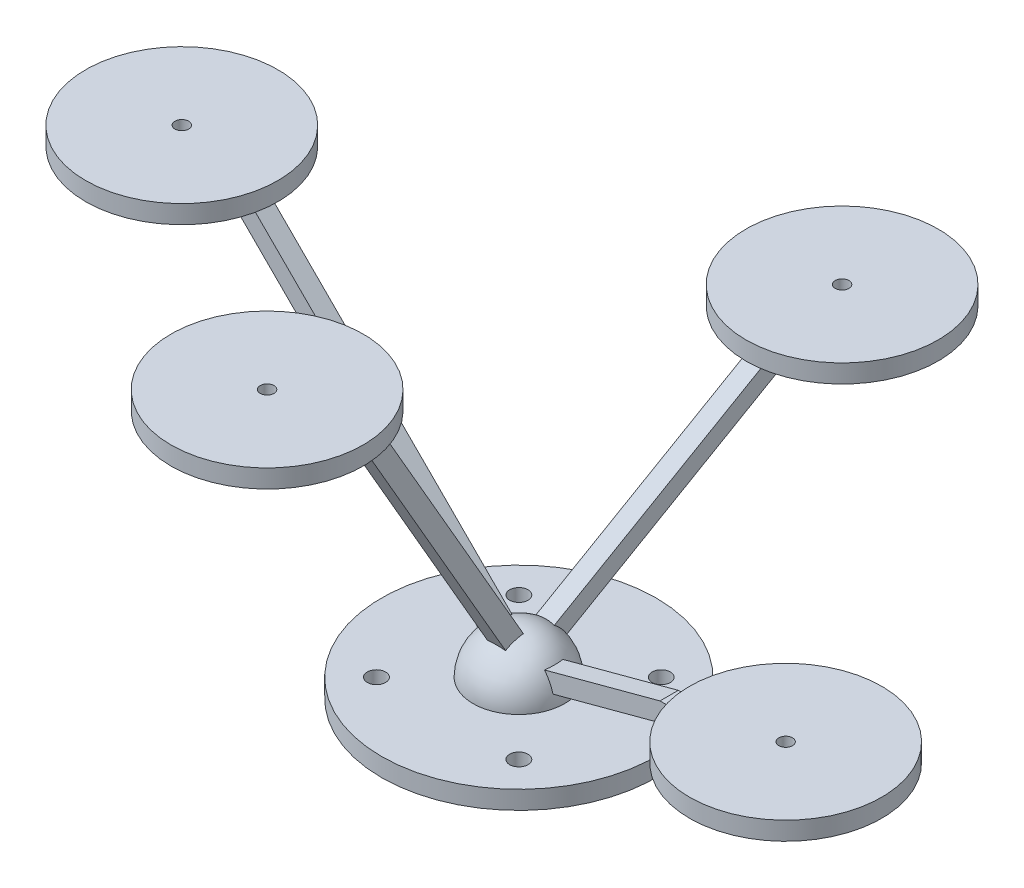
ISO-10303-21;
HEADER;
FILE_DESCRIPTION(('STEP AP214'),'2;1');
FILE_NAME('part.step','',(''),(''),'','','');
FILE_SCHEMA(('AUTOMOTIVE_DESIGN { 1 0 10303 214 1 1 1 1 }'));
ENDSEC;
DATA;
#1=APPLICATION_CONTEXT('core data for automotive mechanical design processes');
#2=APPLICATION_PROTOCOL_DEFINITION('international standard','automotive_design',2000,#1);
#3=PRODUCT_CONTEXT('',#1,'mechanical');
#4=PRODUCT('Part','Part','',(#3));
#5=PRODUCT_RELATED_PRODUCT_CATEGORY('part','',(#4));
#6=PRODUCT_DEFINITION_FORMATION('','',#4);
#7=PRODUCT_DEFINITION_CONTEXT('part definition',#1,'design');
#8=PRODUCT_DEFINITION('design','',#6,#7);
#9=PRODUCT_DEFINITION_SHAPE('','',#8);
#10=(LENGTH_UNIT() NAMED_UNIT(*) SI_UNIT(.MILLI.,.METRE.));
#11=(NAMED_UNIT(*) PLANE_ANGLE_UNIT() SI_UNIT($,.RADIAN.));
#12=(NAMED_UNIT(*) SI_UNIT($,.STERADIAN.) SOLID_ANGLE_UNIT());
#13=UNCERTAINTY_MEASURE_WITH_UNIT(LENGTH_MEASURE(1.E-05),#10,'distance_accuracy_value','');
#14=(GEOMETRIC_REPRESENTATION_CONTEXT(3) GLOBAL_UNCERTAINTY_ASSIGNED_CONTEXT((#13)) GLOBAL_UNIT_ASSIGNED_CONTEXT((#10,
#11,#12)) REPRESENTATION_CONTEXT('',''));
#15=CARTESIAN_POINT('',(0.,0.,0.));
#16=DIRECTION('',(0.,0.,1.));
#17=DIRECTION('',(1.,0.,0.));
#18=AXIS2_PLACEMENT_3D('',#15,#16,#17);
#19=CARTESIAN_POINT('',(0.,2.,0.));
#20=DIRECTION('',(0.,-1.,0.));
#21=DIRECTION('',(0.,0.,-1.));
#22=AXIS2_PLACEMENT_3D('',#19,#20,#21);
#23=SPHERICAL_SURFACE('',#22,5.);
#24=CARTESIAN_POINT('',(0.,2.,0.));
#25=DIRECTION('',(0.,1.,0.));
#26=DIRECTION('',(0.,0.,1.));
#27=AXIS2_PLACEMENT_3D('',#24,#25,#26);
#28=CIRCLE('',#27,5.);
#29=CARTESIAN_POINT('',(0.,2.,5.));
#30=VERTEX_POINT('',#29);
#31=EDGE_CURVE('E326',#30,#30,#28,.T.);
#32=ORIENTED_EDGE('',*,*,#31,.T.);
#33=EDGE_LOOP('',(#32));
#34=FACE_BOUND('',#33,.T.);
#35=CARTESIAN_POINT('',(1.4142135623731,3.4142135623731,0.));
#36=DIRECTION('',(-0.707106781186549,-0.707106781186546,0.));
#37=DIRECTION('',(0.707106781186546,-0.707106781186549,0.));
#38=AXIS2_PLACEMENT_3D('',#35,#36,#37);
#39=CIRCLE('',#38,4.58257569495584);
#40=CARTESIAN_POINT('',(-1.74806409779527,6.57649122254148,-1.));
#41=VERTEX_POINT('',#40);
#42=CARTESIAN_POINT('',(-1.74806409779527,6.57649122254148,1.));
#43=VERTEX_POINT('',#42);
#44=EDGE_CURVE('E337',#41,#43,#39,.F.);
#45=ORIENTED_EDGE('',*,*,#44,.T.);
#46=CARTESIAN_POINT('',(0.,2.,1.));
#47=DIRECTION('',(0.,0.,-1.));
#48=DIRECTION('',(-1.,0.,0.));
#49=AXIS2_PLACEMENT_3D('',#46,#47,#48);
#50=CIRCLE('',#49,4.89897948556636);
#51=CARTESIAN_POINT('',(-3.46410161513775,5.46410161513776,1.));
#52=VERTEX_POINT('',#51);
#53=EDGE_CURVE('E344',#43,#52,#50,.F.);
#54=ORIENTED_EDGE('',*,*,#53,.T.);
#55=CARTESIAN_POINT('',(0.,2.,0.));
#56=DIRECTION('',(0.707106781186549,0.707106781186547,0.));
#57=DIRECTION('',(-0.707106781186546,0.707106781186549,0.));
#58=AXIS2_PLACEMENT_3D('',#55,#56,#57);
#59=CIRCLE('',#58,5.);
#60=CARTESIAN_POINT('',(-3.46410161513775,5.46410161513776,-1.));
#61=VERTEX_POINT('',#60);
#62=EDGE_CURVE('E341',#52,#61,#59,.F.);
#63=ORIENTED_EDGE('',*,*,#62,.T.);
#64=CARTESIAN_POINT('',(0.,2.,-1.));
#65=DIRECTION('',(0.,0.,-1.));
#66=DIRECTION('',(-1.,0.,0.));
#67=AXIS2_PLACEMENT_3D('',#64,#65,#66);
#68=CIRCLE('',#67,4.89897948556636);
#69=EDGE_CURVE('E333',#41,#61,#68,.F.);
#70=ORIENTED_EDGE('',*,*,#69,.F.);
#71=EDGE_LOOP('',(#45,#54,#63,#70));
#72=FACE_BOUND('',#71,.T.);
#73=CARTESIAN_POINT('',(0.,2.,0.));
#74=DIRECTION('',(-0.258819045102514,0.96592582628907,0.));
#75=DIRECTION('',(-0.96592582628907,-0.258819045102514,0.));
#76=AXIS2_PLACEMENT_3D('',#73,#74,#75);
#77=CIRCLE('',#76,5.);
#78=CARTESIAN_POINT('',(4.73205080756889,3.26794919243109,-1.));
#79=VERTEX_POINT('',#78);
#80=CARTESIAN_POINT('',(4.73205080756889,3.26794919243109,1.));
#81=VERTEX_POINT('',#80);
#82=EDGE_CURVE('E351',#79,#81,#77,.F.);
#83=ORIENTED_EDGE('',*,*,#82,.T.);
#84=CARTESIAN_POINT('',(3.802113527405,5.08932561001975,1.));
#85=VERTEX_POINT('',#84);
#86=EDGE_CURVE('E347',#81,#85,#50,.F.);
#87=ORIENTED_EDGE('',*,*,#86,.T.);
#88=CARTESIAN_POINT('',(-0.517638090205028,3.93185165257814,0.));
#89=DIRECTION('',(0.258819045102515,-0.96592582628907,0.));
#90=DIRECTION('',(0.96592582628907,0.258819045102515,0.));
#91=AXIS2_PLACEMENT_3D('',#88,#89,#90);
#92=CIRCLE('',#91,4.58257569495584);
#93=CARTESIAN_POINT('',(3.802113527405,5.08932561001975,-1.));
#94=VERTEX_POINT('',#93);
#95=EDGE_CURVE('E348',#85,#94,#92,.F.);
#96=ORIENTED_EDGE('',*,*,#95,.T.);
#97=EDGE_CURVE('E338',#79,#94,#68,.F.);
#98=ORIENTED_EDGE('',*,*,#97,.F.);
#99=EDGE_LOOP('',(#83,#87,#96,#98));
#100=FACE_BOUND('',#99,.T.);
#101=CARTESIAN_POINT('',(0.,3.,-1.73205080756888));
#102=DIRECTION('',(0.,-0.499999999999998,0.86602540378444));
#103=DIRECTION('',(0.,-0.86602540378444,-0.499999999999998));
#104=AXIS2_PLACEMENT_3D('',#101,#102,#103);
#105=CIRCLE('',#104,4.58257569495584);
#106=CARTESIAN_POINT('',(-1.,6.87298334620742,0.504017169930905));
#107=VERTEX_POINT('',#106);
#108=CARTESIAN_POINT('',(1.,6.87298334620742,0.504017169930905));
#109=VERTEX_POINT('',#108);
#110=EDGE_CURVE('E177',#107,#109,#105,.F.);
#111=ORIENTED_EDGE('',*,*,#110,.T.);
#112=CARTESIAN_POINT('',(1.,2.,0.));
#113=DIRECTION('',(-1.,0.,0.));
#114=DIRECTION('',(0.,0.,1.));
#115=AXIS2_PLACEMENT_3D('',#112,#113,#114);
#116=CIRCLE('',#115,4.89897948556636);
#117=CARTESIAN_POINT('',(1.,6.24264068711929,2.44948974278317));
#118=VERTEX_POINT('',#117);
#119=EDGE_CURVE('E50',#109,#118,#116,.F.);
#120=ORIENTED_EDGE('',*,*,#119,.T.);
#121=CARTESIAN_POINT('',(0.,2.,0.));
#122=DIRECTION('',(0.,0.499999999999998,-0.86602540378444));
#123=DIRECTION('',(0.,0.86602540378444,0.499999999999998));
#124=AXIS2_PLACEMENT_3D('',#121,#122,#123);
#125=CIRCLE('',#124,5.);
#126=CARTESIAN_POINT('',(-1.,6.24264068711929,2.44948974278317));
#127=VERTEX_POINT('',#126);
#128=EDGE_CURVE('E360',#118,#127,#125,.F.);
#129=ORIENTED_EDGE('',*,*,#128,.T.);
#130=CARTESIAN_POINT('',(-1.,2.,0.));
#131=DIRECTION('',(-1.,0.,0.));
#132=DIRECTION('',(0.,0.,1.));
#133=AXIS2_PLACEMENT_3D('',#130,#131,#132);
#134=CIRCLE('',#133,4.89897948556636);
#135=EDGE_CURVE('E354',#107,#127,#134,.F.);
#136=ORIENTED_EDGE('',*,*,#135,.F.);
#137=EDGE_LOOP('',(#111,#120,#129,#136));
#138=FACE_BOUND('',#137,.T.);
#139=CARTESIAN_POINT('',(0.,2.,0.));
#140=DIRECTION('',(0.,0.866025403784442,0.499999999999995));
#141=DIRECTION('',(0.,-0.499999999999995,0.866025403784442));
#142=AXIS2_PLACEMENT_3D('',#139,#140,#141);
#143=CIRCLE('',#142,5.);
#144=CARTESIAN_POINT('',(-1.,4.44948974278315,-4.2426406871193));
#145=VERTEX_POINT('',#144);
#146=CARTESIAN_POINT('',(1.,4.44948974278315,-4.2426406871193));
#147=VERTEX_POINT('',#146);
#148=EDGE_CURVE('E43',#145,#147,#143,.F.);
#149=ORIENTED_EDGE('',*,*,#148,.T.);
#150=CARTESIAN_POINT('',(1.,5.96811878506865,-2.87298334620744));
#151=VERTEX_POINT('',#150);
#152=EDGE_CURVE('E11',#147,#151,#116,.F.);
#153=ORIENTED_EDGE('',*,*,#152,.T.);
#154=CARTESIAN_POINT('',(0.,3.73205080756888,0.999999999999988));
#155=DIRECTION('',(0.,-0.866025403784441,-0.499999999999995));
#156=DIRECTION('',(0.,0.499999999999995,-0.866025403784442));
#157=AXIS2_PLACEMENT_3D('',#154,#155,#156);
#158=CIRCLE('',#157,4.58257569495584);
#159=CARTESIAN_POINT('',(-1.,5.96811878506865,-2.87298334620744));
#160=VERTEX_POINT('',#159);
#161=EDGE_CURVE('E363',#151,#160,#158,.F.);
#162=ORIENTED_EDGE('',*,*,#161,.T.);
#163=EDGE_CURVE('E357',#145,#160,#134,.F.);
#164=ORIENTED_EDGE('',*,*,#163,.F.);
#165=EDGE_LOOP('',(#149,#153,#162,#164));
#166=FACE_BOUND('',#165,.T.);
#167=ADVANCED_FACE('F39',(#34,#72,#100,#138,#166),#23,.T.);
#168=CARTESIAN_POINT('',(0.,2.,0.));
#169=DIRECTION('',(0.,1.,0.));
#170=DIRECTION('',(0.,0.,1.));
#171=AXIS2_PLACEMENT_3D('',#168,#169,#170);
#172=PLANE('',#171);
#173=ORIENTED_EDGE('',*,*,#31,.F.);
#174=EDGE_LOOP('',(#173));
#175=FACE_BOUND('',#174,.T.);
#176=CARTESIAN_POINT('',(-7.77817459305207,2.,7.77817459305198));
#177=DIRECTION('',(0.,1.,0.));
#178=DIRECTION('',(0.,0.,1.));
#179=AXIS2_PLACEMENT_3D('',#176,#177,#178);
#180=CIRCLE('',#179,1.);
#181=CARTESIAN_POINT('',(-7.77817459305207,2.,8.77817459305198));
#182=VERTEX_POINT('',#181);
#183=EDGE_CURVE('E298',#182,#182,#180,.T.);
#184=ORIENTED_EDGE('',*,*,#183,.F.);
#185=EDGE_LOOP('',(#184));
#186=FACE_BOUND('',#185,.T.);
#187=CARTESIAN_POINT('',(7.77817459305206,2.,-7.77817459305199));
#188=DIRECTION('',(0.,1.,0.));
#189=DIRECTION('',(0.,0.,1.));
#190=AXIS2_PLACEMENT_3D('',#187,#188,#189);
#191=CIRCLE('',#190,1.);
#192=CARTESIAN_POINT('',(7.77817459305206,2.,-6.77817459305198));
#193=VERTEX_POINT('',#192);
#194=EDGE_CURVE('E314',#193,#193,#191,.T.);
#195=ORIENTED_EDGE('',*,*,#194,.F.);
#196=EDGE_LOOP('',(#195));
#197=FACE_BOUND('',#196,.T.);
#198=CARTESIAN_POINT('',(0.,2.,0.));
#199=DIRECTION('',(0.,1.,0.));
#200=DIRECTION('',(0.,0.,1.));
#201=AXIS2_PLACEMENT_3D('',#198,#199,#200);
#202=CIRCLE('',#201,15.);
#203=CARTESIAN_POINT('',(0.,2.,15.));
#204=VERTEX_POINT('',#203);
#205=EDGE_CURVE('E322',#204,#204,#202,.T.);
#206=ORIENTED_EDGE('',*,*,#205,.T.);
#207=EDGE_LOOP('',(#206));
#208=FACE_BOUND('',#207,.T.);
#209=CARTESIAN_POINT('',(-7.77817459305204,2.,-7.77817459305201));
#210=DIRECTION('',(0.,1.,0.));
#211=DIRECTION('',(0.,0.,1.));
#212=AXIS2_PLACEMENT_3D('',#209,#210,#211);
#213=CIRCLE('',#212,0.999999999999995);
#214=CARTESIAN_POINT('',(-7.77817459305204,2.,-6.77817459305201));
#215=VERTEX_POINT('',#214);
#216=EDGE_CURVE('E306',#215,#215,#213,.T.);
#217=ORIENTED_EDGE('',*,*,#216,.F.);
#218=EDGE_LOOP('',(#217));
#219=FACE_BOUND('',#218,.T.);
#220=CARTESIAN_POINT('',(7.77817459305204,2.,7.77817459305201));
#221=DIRECTION('',(0.,1.,0.));
#222=DIRECTION('',(0.,0.,1.));
#223=AXIS2_PLACEMENT_3D('',#220,#221,#222);
#224=CIRCLE('',#223,1.);
#225=CARTESIAN_POINT('',(7.77817459305204,2.,8.77817459305201));
#226=VERTEX_POINT('',#225);
#227=EDGE_CURVE('E290',#226,#226,#224,.T.);
#228=ORIENTED_EDGE('',*,*,#227,.F.);
#229=EDGE_LOOP('',(#228));
#230=FACE_BOUND('',#229,.T.);
#231=ADVANCED_FACE('F460',(#175,#186,#197,#208,#219,#230),#172,.T.);
#232=CARTESIAN_POINT('',(0.,0.,0.));
#233=DIRECTION('',(0.,1.,0.));
#234=DIRECTION('',(0.,0.,1.));
#235=AXIS2_PLACEMENT_3D('',#232,#233,#234);
#236=PLANE('',#235);
#237=CARTESIAN_POINT('',(0.,0.,0.));
#238=DIRECTION('',(0.,1.,0.));
#239=DIRECTION('',(0.,0.,1.));
#240=AXIS2_PLACEMENT_3D('',#237,#238,#239);
#241=CIRCLE('',#240,15.);
#242=CARTESIAN_POINT('',(0.,0.,15.));
#243=VERTEX_POINT('',#242);
#244=EDGE_CURVE('E318',#243,#243,#241,.T.);
#245=ORIENTED_EDGE('',*,*,#244,.F.);
#246=EDGE_LOOP('',(#245));
#247=FACE_BOUND('',#246,.T.);
#248=CARTESIAN_POINT('',(7.77817459305206,0.,-7.77817459305199));
#249=DIRECTION('',(0.,1.,0.));
#250=DIRECTION('',(0.,0.,1.));
#251=AXIS2_PLACEMENT_3D('',#248,#249,#250);
#252=CIRCLE('',#251,1.);
#253=CARTESIAN_POINT('',(7.77817459305206,0.,-6.77817459305198));
#254=VERTEX_POINT('',#253);
#255=EDGE_CURVE('E310',#254,#254,#252,.T.);
#256=ORIENTED_EDGE('',*,*,#255,.T.);
#257=EDGE_LOOP('',(#256));
#258=FACE_BOUND('',#257,.T.);
#259=CARTESIAN_POINT('',(-7.77817459305204,0.,-7.77817459305201));
#260=DIRECTION('',(0.,1.,0.));
#261=DIRECTION('',(0.,0.,1.));
#262=AXIS2_PLACEMENT_3D('',#259,#260,#261);
#263=CIRCLE('',#262,0.999999999999995);
#264=CARTESIAN_POINT('',(-7.77817459305204,0.,-6.77817459305201));
#265=VERTEX_POINT('',#264);
#266=EDGE_CURVE('E302',#265,#265,#263,.T.);
#267=ORIENTED_EDGE('',*,*,#266,.T.);
#268=EDGE_LOOP('',(#267));
#269=FACE_BOUND('',#268,.T.);
#270=CARTESIAN_POINT('',(-7.77817459305207,0.,7.77817459305198));
#271=DIRECTION('',(0.,1.,0.));
#272=DIRECTION('',(0.,0.,1.));
#273=AXIS2_PLACEMENT_3D('',#270,#271,#272);
#274=CIRCLE('',#273,1.);
#275=CARTESIAN_POINT('',(-7.77817459305207,0.,8.77817459305198));
#276=VERTEX_POINT('',#275);
#277=EDGE_CURVE('E294',#276,#276,#274,.T.);
#278=ORIENTED_EDGE('',*,*,#277,.T.);
#279=EDGE_LOOP('',(#278));
#280=FACE_BOUND('',#279,.T.);
#281=CARTESIAN_POINT('',(7.77817459305204,0.,7.77817459305201));
#282=DIRECTION('',(0.,1.,0.));
#283=DIRECTION('',(0.,0.,1.));
#284=AXIS2_PLACEMENT_3D('',#281,#282,#283);
#285=CIRCLE('',#284,1.);
#286=CARTESIAN_POINT('',(7.77817459305204,0.,8.77817459305201));
#287=VERTEX_POINT('',#286);
#288=EDGE_CURVE('E289',#287,#287,#285,.T.);
#289=ORIENTED_EDGE('',*,*,#288,.T.);
#290=EDGE_LOOP('',(#289));
#291=FACE_BOUND('',#290,.T.);
#292=ADVANCED_FACE('F466',(#247,#258,#269,#280,#291),#236,.F.);
#293=CARTESIAN_POINT('',(0.,2.,0.));
#294=DIRECTION('',(0.,-1.,0.));
#295=DIRECTION('',(0.,0.,-1.));
#296=AXIS2_PLACEMENT_3D('',#293,#294,#295);
#297=CYLINDRICAL_SURFACE('',#296,15.);
#298=ORIENTED_EDGE('',*,*,#205,.F.);
#299=EDGE_LOOP('',(#298));
#300=FACE_BOUND('',#299,.T.);
#301=ORIENTED_EDGE('',*,*,#244,.T.);
#302=EDGE_LOOP('',(#301));
#303=FACE_BOUND('',#302,.T.);
#304=ADVANCED_FACE('F41',(#300,#303),#297,.T.);
#305=CARTESIAN_POINT('',(7.77817459305206,2.,-7.77817459305199));
#306=DIRECTION('',(0.,-1.,0.));
#307=DIRECTION('',(0.,0.,-1.));
#308=AXIS2_PLACEMENT_3D('',#305,#306,#307);
#309=CYLINDRICAL_SURFACE('',#308,1.);
#310=ORIENTED_EDGE('',*,*,#194,.T.);
#311=EDGE_LOOP('',(#310));
#312=FACE_BOUND('',#311,.T.);
#313=ORIENTED_EDGE('',*,*,#255,.F.);
#314=EDGE_LOOP('',(#313));
#315=FACE_BOUND('',#314,.T.);
#316=ADVANCED_FACE('F486',(#312,#315),#309,.F.);
#317=CARTESIAN_POINT('',(-7.77817459305204,2.,-7.77817459305201));
#318=DIRECTION('',(0.,-1.,0.));
#319=DIRECTION('',(0.,0.,-1.));
#320=AXIS2_PLACEMENT_3D('',#317,#318,#319);
#321=CYLINDRICAL_SURFACE('',#320,0.999999999999995);
#322=ORIENTED_EDGE('',*,*,#216,.T.);
#323=EDGE_LOOP('',(#322));
#324=FACE_BOUND('',#323,.T.);
#325=ORIENTED_EDGE('',*,*,#266,.F.);
#326=EDGE_LOOP('',(#325));
#327=FACE_BOUND('',#326,.T.);
#328=ADVANCED_FACE('F482',(#324,#327),#321,.F.);
#329=CARTESIAN_POINT('',(-7.77817459305207,2.,7.77817459305198));
#330=DIRECTION('',(0.,-1.,0.));
#331=DIRECTION('',(0.,0.,-1.));
#332=AXIS2_PLACEMENT_3D('',#329,#330,#331);
#333=CYLINDRICAL_SURFACE('',#332,1.);
#334=ORIENTED_EDGE('',*,*,#183,.T.);
#335=EDGE_LOOP('',(#334));
#336=FACE_BOUND('',#335,.T.);
#337=ORIENTED_EDGE('',*,*,#277,.F.);
#338=EDGE_LOOP('',(#337));
#339=FACE_BOUND('',#338,.T.);
#340=ADVANCED_FACE('F478',(#336,#339),#333,.F.);
#341=CARTESIAN_POINT('',(7.77817459305204,2.,7.77817459305201));
#342=DIRECTION('',(0.,-1.,0.));
#343=DIRECTION('',(0.,0.,-1.));
#344=AXIS2_PLACEMENT_3D('',#341,#342,#343);
#345=CYLINDRICAL_SURFACE('',#344,1.);
#346=ORIENTED_EDGE('',*,*,#227,.T.);
#347=EDGE_LOOP('',(#346));
#348=FACE_BOUND('',#347,.T.);
#349=ORIENTED_EDGE('',*,*,#288,.F.);
#350=EDGE_LOOP('',(#349));
#351=FACE_BOUND('',#350,.T.);
#352=ADVANCED_FACE('F474',(#348,#351),#345,.F.);
#353=CARTESIAN_POINT('',(0.,0.,1.));
#354=DIRECTION('',(0.,0.,-1.));
#355=DIRECTION('',(-1.,0.,0.));
#356=AXIS2_PLACEMENT_3D('',#353,#354,#355);
#357=PLANE('',#356);
#358=ORIENTED_EDGE('',*,*,#53,.F.);
#359=DIRECTION('',(-0.707106781186546,0.707106781186549,0.));
#360=VECTOR('',#359,1.);
#361=CARTESIAN_POINT('',(-28.9913780286484,33.8198051533947,1.));
#362=LINE('',#361,#360);
#363=CARTESIAN_POINT('',(-28.9913780286484,33.8198051533947,1.));
#364=VERTEX_POINT('',#363);
#365=EDGE_CURVE('E246',#43,#364,#362,.T.);
#366=ORIENTED_EDGE('',*,*,#365,.T.);
#367=DIRECTION('',(-1.,0.,0.));
#368=VECTOR('',#367,1.);
#369=CARTESIAN_POINT('',(-31.8198051533946,33.8198051533947,1.));
#370=LINE('',#369,#368);
#371=CARTESIAN_POINT('',(-31.8198051533946,33.8198051533947,1.));
#372=VERTEX_POINT('',#371);
#373=EDGE_CURVE('E249',#364,#372,#370,.T.);
#374=ORIENTED_EDGE('',*,*,#373,.T.);
#375=DIRECTION('',(0.707106781186546,-0.707106781186548,0.));
#376=VECTOR('',#375,1.);
#377=CARTESIAN_POINT('',(0.,2.,1.));
#378=LINE('',#377,#376);
#379=EDGE_CURVE('E230',#372,#52,#378,.T.);
#380=ORIENTED_EDGE('',*,*,#379,.T.);
#381=EDGE_LOOP('',(#358,#366,#374,#380));
#382=FACE_BOUND('',#381,.T.);
#383=ADVANCED_FACE('F477',(#382),#357,.F.);
#384=CARTESIAN_POINT('',(0.,0.,-1.));
#385=DIRECTION('',(0.,0.,-1.));
#386=DIRECTION('',(-1.,0.,0.));
#387=AXIS2_PLACEMENT_3D('',#384,#385,#386);
#388=PLANE('',#387);
#389=DIRECTION('',(-0.707106781186546,0.707106781186549,0.));
#390=VECTOR('',#389,1.);
#391=CARTESIAN_POINT('',(-28.9913780286484,33.8198051533947,-1.));
#392=LINE('',#391,#390);
#393=CARTESIAN_POINT('',(-28.9913780286484,33.8198051533947,-1.));
#394=VERTEX_POINT('',#393);
#395=EDGE_CURVE('E268',#41,#394,#392,.T.);
#396=ORIENTED_EDGE('',*,*,#395,.F.);
#397=ORIENTED_EDGE('',*,*,#69,.T.);
#398=DIRECTION('',(0.707106781186546,-0.707106781186548,0.));
#399=VECTOR('',#398,1.);
#400=CARTESIAN_POINT('',(0.,2.,-1.));
#401=LINE('',#400,#399);
#402=CARTESIAN_POINT('',(-31.8198051533946,33.8198051533947,-1.));
#403=VERTEX_POINT('',#402);
#404=EDGE_CURVE('E225',#403,#61,#401,.T.);
#405=ORIENTED_EDGE('',*,*,#404,.F.);
#406=DIRECTION('',(-1.,0.,0.));
#407=VECTOR('',#406,1.);
#408=CARTESIAN_POINT('',(-31.8198051533946,33.8198051533947,-1.));
#409=LINE('',#408,#407);
#410=EDGE_CURVE('E235',#394,#403,#409,.T.);
#411=ORIENTED_EDGE('',*,*,#410,.F.);
#412=EDGE_LOOP('',(#396,#397,#405,#411));
#413=FACE_BOUND('',#412,.T.);
#414=ADVANCED_FACE('F541',(#413),#388,.T.);
#415=CARTESIAN_POINT('',(-28.9913780286484,33.8198051533947,1.));
#416=DIRECTION('',(-0.707106781186549,-0.707106781186546,0.));
#417=DIRECTION('',(0.707106781186546,-0.707106781186549,0.));
#418=AXIS2_PLACEMENT_3D('',#415,#416,#417);
#419=PLANE('',#418);
#420=ORIENTED_EDGE('',*,*,#44,.F.);
#421=ORIENTED_EDGE('',*,*,#395,.T.);
#422=DIRECTION('',(0.,0.,-1.));
#423=VECTOR('',#422,1.);
#424=CARTESIAN_POINT('',(-28.9913780286484,33.8198051533947,1.));
#425=LINE('',#424,#423);
#426=EDGE_CURVE('E277',#364,#394,#425,.T.);
#427=ORIENTED_EDGE('',*,*,#426,.F.);
#428=ORIENTED_EDGE('',*,*,#365,.F.);
#429=EDGE_LOOP('',(#420,#421,#427,#428));
#430=FACE_BOUND('',#429,.T.);
#431=ADVANCED_FACE('F551',(#430),#419,.F.);
#432=CARTESIAN_POINT('',(0.,2.,1.));
#433=DIRECTION('',(0.707106781186549,0.707106781186547,0.));
#434=DIRECTION('',(-0.707106781186546,0.707106781186549,0.));
#435=AXIS2_PLACEMENT_3D('',#432,#433,#434);
#436=PLANE('',#435);
#437=ORIENTED_EDGE('',*,*,#62,.F.);
#438=ORIENTED_EDGE('',*,*,#379,.F.);
#439=DIRECTION('',(0.,0.,-1.));
#440=VECTOR('',#439,1.);
#441=CARTESIAN_POINT('',(-31.8198051533946,33.8198051533947,1.));
#442=LINE('',#441,#440);
#443=EDGE_CURVE('E252',#372,#403,#442,.T.);
#444=ORIENTED_EDGE('',*,*,#443,.T.);
#445=ORIENTED_EDGE('',*,*,#404,.T.);
#446=EDGE_LOOP('',(#437,#438,#444,#445));
#447=FACE_BOUND('',#446,.T.);
#448=ADVANCED_FACE('F472',(#447),#436,.F.);
#449=ORIENTED_EDGE('',*,*,#86,.F.);
#450=DIRECTION('',(0.96592582628907,0.258819045102514,0.));
#451=VECTOR('',#450,1.);
#452=CARTESIAN_POINT('',(0.,2.,1.));
#453=LINE('',#452,#451);
#454=CARTESIAN_POINT('',(24.1481456572267,8.47047612756286,1.));
#455=VERTEX_POINT('',#454);
#456=EDGE_CURVE('E234',#81,#455,#453,.T.);
#457=ORIENTED_EDGE('',*,*,#456,.T.);
#458=DIRECTION('',(-1.,0.,0.));
#459=VECTOR('',#458,1.);
#460=CARTESIAN_POINT('',(16.420739046914,8.47047612756286,1.));
#461=LINE('',#460,#459);
#462=CARTESIAN_POINT('',(18.6958731770433,8.47047612756286,1.));
#463=VERTEX_POINT('',#462);
#464=EDGE_CURVE('E239',#455,#463,#461,.T.);
#465=ORIENTED_EDGE('',*,*,#464,.T.);
#466=CARTESIAN_POINT('',(16.420739046914,8.47047612756286,1.));
#467=VERTEX_POINT('',#466);
#468=EDGE_CURVE('E238',#463,#467,#461,.T.);
#469=ORIENTED_EDGE('',*,*,#468,.T.);
#470=DIRECTION('',(-0.96592582628907,-0.258819045102515,0.));
#471=VECTOR('',#470,1.);
#472=CARTESIAN_POINT('',(0.,4.07055236082016,1.));
#473=LINE('',#472,#471);
#474=EDGE_CURVE('E242',#467,#85,#473,.T.);
#475=ORIENTED_EDGE('',*,*,#474,.T.);
#476=EDGE_LOOP('',(#449,#457,#465,#469,#475));
#477=FACE_BOUND('',#476,.T.);
#478=ADVANCED_FACE('F544',(#477),#357,.F.);
#479=DIRECTION('',(0.96592582628907,0.258819045102514,0.));
#480=VECTOR('',#479,1.);
#481=CARTESIAN_POINT('',(0.,2.,-1.));
#482=LINE('',#481,#480);
#483=CARTESIAN_POINT('',(24.1481456572267,8.47047612756286,-1.));
#484=VERTEX_POINT('',#483);
#485=EDGE_CURVE('E256',#79,#484,#482,.T.);
#486=ORIENTED_EDGE('',*,*,#485,.F.);
#487=ORIENTED_EDGE('',*,*,#97,.T.);
#488=DIRECTION('',(-0.96592582628907,-0.258819045102515,0.));
#489=VECTOR('',#488,1.);
#490=CARTESIAN_POINT('',(0.,4.07055236082016,-1.));
#491=LINE('',#490,#489);
#492=CARTESIAN_POINT('',(16.420739046914,8.47047612756286,-1.));
#493=VERTEX_POINT('',#492);
#494=EDGE_CURVE('E264',#493,#94,#491,.T.);
#495=ORIENTED_EDGE('',*,*,#494,.F.);
#496=DIRECTION('',(-1.,0.,0.));
#497=VECTOR('',#496,1.);
#498=CARTESIAN_POINT('',(16.420739046914,8.47047612756286,-1.));
#499=LINE('',#498,#497);
#500=CARTESIAN_POINT('',(18.6958731770433,8.47047612756285,-1.));
#501=VERTEX_POINT('',#500);
#502=EDGE_CURVE('E259',#501,#493,#499,.T.);
#503=ORIENTED_EDGE('',*,*,#502,.F.);
#504=EDGE_CURVE('E260',#484,#501,#499,.T.);
#505=ORIENTED_EDGE('',*,*,#504,.F.);
#506=EDGE_LOOP('',(#486,#487,#495,#503,#505));
#507=FACE_BOUND('',#506,.T.);
#508=ADVANCED_FACE('F554',(#507),#388,.T.);
#509=CARTESIAN_POINT('',(0.,2.,1.));
#510=DIRECTION('',(-0.258819045102514,0.96592582628907,0.));
#511=DIRECTION('',(-0.96592582628907,-0.258819045102514,0.));
#512=AXIS2_PLACEMENT_3D('',#509,#510,#511);
#513=PLANE('',#512);
#514=ORIENTED_EDGE('',*,*,#82,.F.);
#515=ORIENTED_EDGE('',*,*,#485,.T.);
#516=DIRECTION('',(0.,0.,-1.));
#517=VECTOR('',#516,1.);
#518=CARTESIAN_POINT('',(24.1481456572267,8.47047612756286,1.));
#519=LINE('',#518,#517);
#520=EDGE_CURVE('E285',#455,#484,#519,.T.);
#521=ORIENTED_EDGE('',*,*,#520,.F.);
#522=ORIENTED_EDGE('',*,*,#456,.F.);
#523=EDGE_LOOP('',(#514,#515,#521,#522));
#524=FACE_BOUND('',#523,.T.);
#525=ADVANCED_FACE('F581',(#524),#513,.F.);
#526=CARTESIAN_POINT('',(16.420739046914,8.47047612756286,1.));
#527=DIRECTION('',(0.,-1.,0.));
#528=DIRECTION('',(1.,0.,0.));
#529=AXIS2_PLACEMENT_3D('',#526,#527,#528);
#530=PLANE('',#529);
#531=CARTESIAN_POINT('',(29.1481456572267,8.47047612756286,0.));
#532=DIRECTION('',(0.,1.,0.));
#533=DIRECTION('',(0.,0.,1.));
#534=AXIS2_PLACEMENT_3D('',#531,#532,#533);
#535=CIRCLE('',#534,10.5);
#536=EDGE_CURVE('E226',#501,#463,#535,.T.);
#537=ORIENTED_EDGE('',*,*,#536,.F.);
#538=ORIENTED_EDGE('',*,*,#502,.T.);
#539=DIRECTION('',(0.,0.,-1.));
#540=VECTOR('',#539,1.);
#541=CARTESIAN_POINT('',(16.420739046914,8.47047612756286,1.));
#542=LINE('',#541,#540);
#543=EDGE_CURVE('E281',#467,#493,#542,.T.);
#544=ORIENTED_EDGE('',*,*,#543,.F.);
#545=ORIENTED_EDGE('',*,*,#468,.F.);
#546=EDGE_LOOP('',(#537,#538,#544,#545));
#547=FACE_BOUND('',#546,.T.);
#548=ADVANCED_FACE('F588',(#547),#530,.F.);
#549=CARTESIAN_POINT('',(0.,4.07055236082016,1.));
#550=DIRECTION('',(0.258819045102515,-0.96592582628907,0.));
#551=DIRECTION('',(0.96592582628907,0.258819045102515,0.));
#552=AXIS2_PLACEMENT_3D('',#549,#550,#551);
#553=PLANE('',#552);
#554=ORIENTED_EDGE('',*,*,#95,.F.);
#555=ORIENTED_EDGE('',*,*,#474,.F.);
#556=ORIENTED_EDGE('',*,*,#543,.T.);
#557=ORIENTED_EDGE('',*,*,#494,.T.);
#558=EDGE_LOOP('',(#554,#555,#556,#557));
#559=FACE_BOUND('',#558,.T.);
#560=ADVANCED_FACE('F595',(#559),#553,.F.);
#561=CARTESIAN_POINT('',(29.1481456572267,8.47047612756286,0.));
#562=DIRECTION('',(0.,1.,0.));
#563=DIRECTION('',(0.,0.,1.));
#564=AXIS2_PLACEMENT_3D('',#561,#562,#563);
#565=PLANE('',#564);
#566=CARTESIAN_POINT('',(29.1481456572267,8.47047612756286,0.));
#567=DIRECTION('',(0.,1.,0.));
#568=DIRECTION('',(0.,0.,1.));
#569=AXIS2_PLACEMENT_3D('',#566,#567,#568);
#570=CIRCLE('',#569,0.750000000000002);
#571=CARTESIAN_POINT('',(29.1481456572267,8.47047612756286,0.750000000000002));
#572=VERTEX_POINT('',#571);
#573=EDGE_CURVE('E209',#572,#572,#570,.T.);
#574=ORIENTED_EDGE('',*,*,#573,.T.);
#575=EDGE_LOOP('',(#574));
#576=FACE_BOUND('',#575,.T.);
#577=ORIENTED_EDGE('',*,*,#520,.T.);
#578=ORIENTED_EDGE('',*,*,#504,.T.);
#579=EDGE_CURVE('E217',#463,#501,#535,.T.);
#580=ORIENTED_EDGE('',*,*,#579,.F.);
#581=ORIENTED_EDGE('',*,*,#464,.F.);
#582=EDGE_LOOP('',(#577,#578,#580,#581));
#583=FACE_BOUND('',#582,.T.);
#584=ADVANCED_FACE('F603',(#576,#583),#565,.F.);
#585=CARTESIAN_POINT('',(29.1481456572267,10.4704761275629,0.));
#586=DIRECTION('',(0.,1.,0.));
#587=DIRECTION('',(0.,0.,1.));
#588=AXIS2_PLACEMENT_3D('',#585,#586,#587);
#589=PLANE('',#588);
#590=CARTESIAN_POINT('',(29.1481456572267,10.4704761275629,0.));
#591=DIRECTION('',(0.,1.,0.));
#592=DIRECTION('',(0.,0.,1.));
#593=AXIS2_PLACEMENT_3D('',#590,#591,#592);
#594=CIRCLE('',#593,10.5);
#595=CARTESIAN_POINT('',(29.1481456572267,10.4704761275629,10.5));
#596=VERTEX_POINT('',#595);
#597=EDGE_CURVE('E221',#596,#596,#594,.T.);
#598=ORIENTED_EDGE('',*,*,#597,.T.);
#599=EDGE_LOOP('',(#598));
#600=FACE_BOUND('',#599,.T.);
#601=CARTESIAN_POINT('',(29.1481456572267,10.4704761275629,0.));
#602=DIRECTION('',(0.,1.,0.));
#603=DIRECTION('',(0.,0.,1.));
#604=AXIS2_PLACEMENT_3D('',#601,#602,#603);
#605=CIRCLE('',#604,0.750000000000002);
#606=CARTESIAN_POINT('',(29.1481456572267,10.4704761275629,0.750000000000002));
#607=VERTEX_POINT('',#606);
#608=EDGE_CURVE('E213',#607,#607,#605,.T.);
#609=ORIENTED_EDGE('',*,*,#608,.F.);
#610=EDGE_LOOP('',(#609));
#611=FACE_BOUND('',#610,.T.);
#612=ADVANCED_FACE('F610',(#600,#611),#589,.T.);
#613=CARTESIAN_POINT('',(29.1481456572267,10.4704761275629,0.));
#614=DIRECTION('',(0.,-1.,0.));
#615=DIRECTION('',(0.,0.,-1.));
#616=AXIS2_PLACEMENT_3D('',#613,#614,#615);
#617=CYLINDRICAL_SURFACE('',#616,10.5);
#618=ORIENTED_EDGE('',*,*,#597,.F.);
#619=EDGE_LOOP('',(#618));
#620=FACE_BOUND('',#619,.T.);
#621=ORIENTED_EDGE('',*,*,#536,.T.);
#622=ORIENTED_EDGE('',*,*,#579,.T.);
#623=EDGE_LOOP('',(#621,#622));
#624=FACE_BOUND('',#623,.T.);
#625=ADVANCED_FACE('F618',(#620,#624),#617,.T.);
#626=CARTESIAN_POINT('',(29.1481456572267,10.4704761275629,0.));
#627=DIRECTION('',(0.,-1.,0.));
#628=DIRECTION('',(0.,0.,-1.));
#629=AXIS2_PLACEMENT_3D('',#626,#627,#628);
#630=CYLINDRICAL_SURFACE('',#629,0.750000000000002);
#631=ORIENTED_EDGE('',*,*,#608,.T.);
#632=EDGE_LOOP('',(#631));
#633=FACE_BOUND('',#632,.T.);
#634=ORIENTED_EDGE('',*,*,#573,.F.);
#635=EDGE_LOOP('',(#634));
#636=FACE_BOUND('',#635,.T.);
#637=ADVANCED_FACE('F626',(#633,#636),#630,.F.);
#638=CARTESIAN_POINT('',(-36.8198051533946,33.8198051533947,0.));
#639=DIRECTION('',(0.,1.,0.));
#640=DIRECTION('',(0.,0.,1.));
#641=AXIS2_PLACEMENT_3D('',#638,#639,#640);
#642=PLANE('',#641);
#643=CARTESIAN_POINT('',(-36.8198051533946,33.8198051533947,0.));
#644=DIRECTION('',(0.,1.,0.));
#645=DIRECTION('',(0.,0.,1.));
#646=AXIS2_PLACEMENT_3D('',#643,#644,#645);
#647=CIRCLE('',#646,10.5);
#648=CARTESIAN_POINT('',(-36.8198051533946,33.8198051533947,10.5));
#649=VERTEX_POINT('',#648);
#650=EDGE_CURVE('E201',#649,#649,#647,.T.);
#651=ORIENTED_EDGE('',*,*,#650,.F.);
#652=EDGE_LOOP('',(#651));
#653=FACE_BOUND('',#652,.T.);
#654=CARTESIAN_POINT('',(-36.8198051533946,33.8198051533947,0.));
#655=DIRECTION('',(0.,1.,0.));
#656=DIRECTION('',(0.,0.,1.));
#657=AXIS2_PLACEMENT_3D('',#654,#655,#656);
#658=CIRCLE('',#657,0.749999999999999);
#659=CARTESIAN_POINT('',(-36.8198051533946,33.8198051533947,0.749999999999999));
#660=VERTEX_POINT('',#659);
#661=EDGE_CURVE('E196',#660,#660,#658,.T.);
#662=ORIENTED_EDGE('',*,*,#661,.T.);
#663=EDGE_LOOP('',(#662));
#664=FACE_BOUND('',#663,.T.);
#665=ORIENTED_EDGE('',*,*,#426,.T.);
#666=ORIENTED_EDGE('',*,*,#410,.T.);
#667=ORIENTED_EDGE('',*,*,#443,.F.);
#668=ORIENTED_EDGE('',*,*,#373,.F.);
#669=EDGE_LOOP('',(#665,#666,#667,#668));
#670=FACE_BOUND('',#669,.T.);
#671=ADVANCED_FACE('F633',(#653,#664,#670),#642,.F.);
#672=CARTESIAN_POINT('',(-36.8198051533946,35.8198051533947,0.));
#673=DIRECTION('',(0.,1.,0.));
#674=DIRECTION('',(0.,0.,1.));
#675=AXIS2_PLACEMENT_3D('',#672,#673,#674);
#676=PLANE('',#675);
#677=CARTESIAN_POINT('',(-36.8198051533946,35.8198051533947,0.));
#678=DIRECTION('',(0.,1.,0.));
#679=DIRECTION('',(0.,0.,1.));
#680=AXIS2_PLACEMENT_3D('',#677,#678,#679);
#681=CIRCLE('',#680,10.5);
#682=CARTESIAN_POINT('',(-36.8198051533946,35.8198051533947,10.5));
#683=VERTEX_POINT('',#682);
#684=EDGE_CURVE('E205',#683,#683,#681,.T.);
#685=ORIENTED_EDGE('',*,*,#684,.T.);
#686=EDGE_LOOP('',(#685));
#687=FACE_BOUND('',#686,.T.);
#688=CARTESIAN_POINT('',(-36.8198051533946,35.8198051533947,0.));
#689=DIRECTION('',(0.,1.,0.));
#690=DIRECTION('',(0.,0.,1.));
#691=AXIS2_PLACEMENT_3D('',#688,#689,#690);
#692=CIRCLE('',#691,0.749999999999999);
#693=CARTESIAN_POINT('',(-36.8198051533946,35.8198051533947,0.749999999999999));
#694=VERTEX_POINT('',#693);
#695=EDGE_CURVE('E197',#694,#694,#692,.T.);
#696=ORIENTED_EDGE('',*,*,#695,.F.);
#697=EDGE_LOOP('',(#696));
#698=FACE_BOUND('',#697,.T.);
#699=ADVANCED_FACE('F640',(#687,#698),#676,.T.);
#700=CARTESIAN_POINT('',(-36.8198051533946,35.8198051533947,0.));
#701=DIRECTION('',(0.,-1.,0.));
#702=DIRECTION('',(0.,0.,-1.));
#703=AXIS2_PLACEMENT_3D('',#700,#701,#702);
#704=CYLINDRICAL_SURFACE('',#703,10.5);
#705=ORIENTED_EDGE('',*,*,#684,.F.);
#706=EDGE_LOOP('',(#705));
#707=FACE_BOUND('',#706,.T.);
#708=ORIENTED_EDGE('',*,*,#650,.T.);
#709=EDGE_LOOP('',(#708));
#710=FACE_BOUND('',#709,.T.);
#711=ADVANCED_FACE('F648',(#707,#710),#704,.T.);
#712=CARTESIAN_POINT('',(-36.8198051533946,35.8198051533947,0.));
#713=DIRECTION('',(0.,-1.,0.));
#714=DIRECTION('',(0.,0.,-1.));
#715=AXIS2_PLACEMENT_3D('',#712,#713,#714);
#716=CYLINDRICAL_SURFACE('',#715,0.749999999999999);
#717=ORIENTED_EDGE('',*,*,#695,.T.);
#718=EDGE_LOOP('',(#717));
#719=FACE_BOUND('',#718,.T.);
#720=ORIENTED_EDGE('',*,*,#661,.F.);
#721=EDGE_LOOP('',(#720));
#722=FACE_BOUND('',#721,.T.);
#723=ADVANCED_FACE('F656',(#719,#722),#716,.F.);
#724=CARTESIAN_POINT('',(1.,0.,0.));
#725=DIRECTION('',(-1.,0.,0.));
#726=DIRECTION('',(0.,0.,1.));
#727=AXIS2_PLACEMENT_3D('',#724,#725,#726);
#728=PLANE('',#727);
#729=ORIENTED_EDGE('',*,*,#119,.F.);
#730=DIRECTION('',(0.,0.86602540378444,0.499999999999998));
#731=VECTOR('',#730,1.);
#732=CARTESIAN_POINT('',(1.,6.00000000000001,0.));
#733=LINE('',#732,#731);
#734=CARTESIAN_POINT('',(1.,40.9711431702998,20.1905989232414));
#735=VERTEX_POINT('',#734);
#736=EDGE_CURVE('E394',#109,#735,#733,.T.);
#737=ORIENTED_EDGE('',*,*,#736,.T.);
#738=DIRECTION('',(0.,0.,1.));
#739=VECTOR('',#738,1.);
#740=CARTESIAN_POINT('',(1.,40.9711431702998,22.4999999999999));
#741=LINE('',#740,#739);
#742=CARTESIAN_POINT('',(1.,40.9711431702998,22.4999999999999));
#743=VERTEX_POINT('',#742);
#744=EDGE_CURVE('E182',#735,#743,#741,.T.);
#745=ORIENTED_EDGE('',*,*,#744,.T.);
#746=DIRECTION('',(0.,-0.86602540378444,-0.499999999999998));
#747=VECTOR('',#746,1.);
#748=CARTESIAN_POINT('',(1.,2.,0.));
#749=LINE('',#748,#747);
#750=EDGE_CURVE('E168',#743,#118,#749,.T.);
#751=ORIENTED_EDGE('',*,*,#750,.T.);
#752=EDGE_LOOP('',(#729,#737,#745,#751));
#753=FACE_BOUND('',#752,.T.);
#754=ADVANCED_FACE('F664',(#753),#728,.F.);
#755=CARTESIAN_POINT('',(-1.,0.,0.));
#756=DIRECTION('',(-1.,0.,0.));
#757=DIRECTION('',(0.,0.,1.));
#758=AXIS2_PLACEMENT_3D('',#755,#756,#757);
#759=PLANE('',#758);
#760=DIRECTION('',(0.,0.86602540378444,0.499999999999998));
#761=VECTOR('',#760,1.);
#762=CARTESIAN_POINT('',(-1.,6.00000000000001,0.));
#763=LINE('',#762,#761);
#764=CARTESIAN_POINT('',(-1.,40.9711431702998,20.1905989232414));
#765=VERTEX_POINT('',#764);
#766=EDGE_CURVE('E161',#107,#765,#763,.T.);
#767=ORIENTED_EDGE('',*,*,#766,.F.);
#768=ORIENTED_EDGE('',*,*,#135,.T.);
#769=DIRECTION('',(0.,-0.86602540378444,-0.499999999999998));
#770=VECTOR('',#769,1.);
#771=CARTESIAN_POINT('',(-1.,2.,0.));
#772=LINE('',#771,#770);
#773=CARTESIAN_POINT('',(-1.,40.9711431702998,22.4999999999999));
#774=VERTEX_POINT('',#773);
#775=EDGE_CURVE('E163',#774,#127,#772,.T.);
#776=ORIENTED_EDGE('',*,*,#775,.F.);
#777=DIRECTION('',(0.,0.,1.));
#778=VECTOR('',#777,1.);
#779=CARTESIAN_POINT('',(-1.,40.9711431702998,22.4999999999999));
#780=LINE('',#779,#778);
#781=EDGE_CURVE('E157',#765,#774,#780,.T.);
#782=ORIENTED_EDGE('',*,*,#781,.F.);
#783=EDGE_LOOP('',(#767,#768,#776,#782));
#784=FACE_BOUND('',#783,.T.);
#785=ADVANCED_FACE('F159',(#784),#759,.T.);
#786=CARTESIAN_POINT('',(1.,6.00000000000001,0.));
#787=DIRECTION('',(0.,-0.499999999999998,0.86602540378444));
#788=DIRECTION('',(0.,-0.86602540378444,-0.499999999999998));
#789=AXIS2_PLACEMENT_3D('',#786,#787,#788);
#790=PLANE('',#789);
#791=ORIENTED_EDGE('',*,*,#110,.F.);
#792=ORIENTED_EDGE('',*,*,#766,.T.);
#793=DIRECTION('',(-1.,0.,0.));
#794=VECTOR('',#793,1.);
#795=CARTESIAN_POINT('',(1.,40.9711431702998,20.1905989232414));
#796=LINE('',#795,#794);
#797=EDGE_CURVE('E175',#735,#765,#796,.T.);
#798=ORIENTED_EDGE('',*,*,#797,.F.);
#799=ORIENTED_EDGE('',*,*,#736,.F.);
#800=EDGE_LOOP('',(#791,#792,#798,#799));
#801=FACE_BOUND('',#800,.T.);
#802=ADVANCED_FACE('F173',(#801),#790,.F.);
#803=CARTESIAN_POINT('',(1.,2.,0.));
#804=DIRECTION('',(0.,0.499999999999998,-0.86602540378444));
#805=DIRECTION('',(0.,0.86602540378444,0.499999999999998));
#806=AXIS2_PLACEMENT_3D('',#803,#804,#805);
#807=PLANE('',#806);
#808=ORIENTED_EDGE('',*,*,#128,.F.);
#809=ORIENTED_EDGE('',*,*,#750,.F.);
#810=DIRECTION('',(-1.,0.,0.));
#811=VECTOR('',#810,1.);
#812=CARTESIAN_POINT('',(1.,40.9711431702998,22.4999999999999));
#813=LINE('',#812,#811);
#814=EDGE_CURVE('E185',#743,#774,#813,.T.);
#815=ORIENTED_EDGE('',*,*,#814,.T.);
#816=ORIENTED_EDGE('',*,*,#775,.T.);
#817=EDGE_LOOP('',(#808,#809,#815,#816));
#818=FACE_BOUND('',#817,.T.);
#819=ADVANCED_FACE('F687',(#818),#807,.F.);
#820=ORIENTED_EDGE('',*,*,#152,.F.);
#821=DIRECTION('',(0.,0.499999999999995,-0.866025403784442));
#822=VECTOR('',#821,1.);
#823=CARTESIAN_POINT('',(1.,2.,0.));
#824=LINE('',#823,#822);
#825=CARTESIAN_POINT('',(1.,19.4999999999998,-30.3108891324555));
#826=VERTEX_POINT('',#825);
#827=EDGE_CURVE('E403',#147,#826,#824,.T.);
#828=ORIENTED_EDGE('',*,*,#827,.T.);
#829=DIRECTION('',(0.,0.,1.));
#830=VECTOR('',#829,1.);
#831=CARTESIAN_POINT('',(1.,19.4999999999998,-26.3108891324554));
#832=LINE('',#831,#830);
#833=CARTESIAN_POINT('',(1.,19.4999999999998,-26.3108891324554));
#834=VERTEX_POINT('',#833);
#835=EDGE_CURVE('E400',#826,#834,#832,.T.);
#836=ORIENTED_EDGE('',*,*,#835,.T.);
#837=DIRECTION('',(0.,-0.499999999999995,0.866025403784441));
#838=VECTOR('',#837,1.);
#839=CARTESIAN_POINT('',(1.,4.30940107675849,0.));
#840=LINE('',#839,#838);
#841=EDGE_CURVE('E397',#834,#151,#840,.T.);
#842=ORIENTED_EDGE('',*,*,#841,.T.);
#843=EDGE_LOOP('',(#820,#828,#836,#842));
#844=FACE_BOUND('',#843,.T.);
#845=ADVANCED_FACE('F674',(#844),#728,.F.);
#846=DIRECTION('',(0.,0.499999999999995,-0.866025403784442));
#847=VECTOR('',#846,1.);
#848=CARTESIAN_POINT('',(-1.,2.,0.));
#849=LINE('',#848,#847);
#850=CARTESIAN_POINT('',(-1.,19.4999999999998,-30.3108891324555));
#851=VERTEX_POINT('',#850);
#852=EDGE_CURVE('E375',#145,#851,#849,.T.);
#853=ORIENTED_EDGE('',*,*,#852,.F.);
#854=ORIENTED_EDGE('',*,*,#163,.T.);
#855=DIRECTION('',(0.,-0.499999999999995,0.866025403784441));
#856=VECTOR('',#855,1.);
#857=CARTESIAN_POINT('',(-1.,4.30940107675849,0.));
#858=LINE('',#857,#856);
#859=CARTESIAN_POINT('',(-1.,19.4999999999998,-26.3108891324554));
#860=VERTEX_POINT('',#859);
#861=EDGE_CURVE('E179',#860,#160,#858,.T.);
#862=ORIENTED_EDGE('',*,*,#861,.F.);
#863=DIRECTION('',(0.,0.,1.));
#864=VECTOR('',#863,1.);
#865=CARTESIAN_POINT('',(-1.,19.4999999999998,-26.3108891324554));
#866=LINE('',#865,#864);
#867=EDGE_CURVE('E382',#851,#860,#866,.T.);
#868=ORIENTED_EDGE('',*,*,#867,.F.);
#869=EDGE_LOOP('',(#853,#854,#862,#868));
#870=FACE_BOUND('',#869,.T.);
#871=ADVANCED_FACE('F372',(#870),#759,.T.);
#872=CARTESIAN_POINT('',(1.,2.,0.));
#873=DIRECTION('',(0.,0.866025403784442,0.499999999999995));
#874=DIRECTION('',(0.,-0.499999999999995,0.866025403784442));
#875=AXIS2_PLACEMENT_3D('',#872,#873,#874);
#876=PLANE('',#875);
#877=ORIENTED_EDGE('',*,*,#148,.F.);
#878=ORIENTED_EDGE('',*,*,#852,.T.);
#879=DIRECTION('',(-1.,0.,0.));
#880=VECTOR('',#879,1.);
#881=CARTESIAN_POINT('',(1.,19.4999999999998,-30.3108891324555));
#882=LINE('',#881,#880);
#883=EDGE_CURVE('E189',#826,#851,#882,.T.);
#884=ORIENTED_EDGE('',*,*,#883,.F.);
#885=ORIENTED_EDGE('',*,*,#827,.F.);
#886=EDGE_LOOP('',(#877,#878,#884,#885));
#887=FACE_BOUND('',#886,.T.);
#888=ADVANCED_FACE('F708',(#887),#876,.F.);
#889=CARTESIAN_POINT('',(1.,4.30940107675849,0.));
#890=DIRECTION('',(0.,-0.866025403784441,-0.499999999999995));
#891=DIRECTION('',(0.,0.499999999999995,-0.866025403784442));
#892=AXIS2_PLACEMENT_3D('',#889,#890,#891);
#893=PLANE('',#892);
#894=ORIENTED_EDGE('',*,*,#161,.F.);
#895=ORIENTED_EDGE('',*,*,#841,.F.);
#896=DIRECTION('',(-1.,0.,0.));
#897=VECTOR('',#896,1.);
#898=CARTESIAN_POINT('',(1.,19.4999999999998,-26.3108891324554));
#899=LINE('',#898,#897);
#900=EDGE_CURVE('E184',#834,#860,#899,.T.);
#901=ORIENTED_EDGE('',*,*,#900,.T.);
#902=ORIENTED_EDGE('',*,*,#861,.T.);
#903=EDGE_LOOP('',(#894,#895,#901,#902));
#904=FACE_BOUND('',#903,.T.);
#905=ADVANCED_FACE('F377',(#904),#893,.F.);
#906=CARTESIAN_POINT('',(0.,19.4999999999998,-35.3108891324555));
#907=DIRECTION('',(0.,1.,0.));
#908=DIRECTION('',(0.,0.,1.));
#909=AXIS2_PLACEMENT_3D('',#906,#907,#908);
#910=PLANE('',#909);
#911=CARTESIAN_POINT('',(0.,19.4999999999998,-35.3108891324555));
#912=DIRECTION('',(0.,1.,0.));
#913=DIRECTION('',(0.,0.,1.));
#914=AXIS2_PLACEMENT_3D('',#911,#912,#913);
#915=CIRCLE('',#914,10.5);
#916=CARTESIAN_POINT('',(0.,19.4999999999998,-24.8108891324554));
#917=VERTEX_POINT('',#916);
#918=EDGE_CURVE('E409',#917,#917,#915,.T.);
#919=ORIENTED_EDGE('',*,*,#918,.F.);
#920=EDGE_LOOP('',(#919));
#921=FACE_BOUND('',#920,.T.);
#922=CARTESIAN_POINT('',(0.,19.4999999999998,-35.3108891324555));
#923=DIRECTION('',(0.,1.,0.));
#924=DIRECTION('',(0.,0.,1.));
#925=AXIS2_PLACEMENT_3D('',#922,#923,#924);
#926=CIRCLE('',#925,0.75);
#927=CARTESIAN_POINT('',(0.,19.4999999999998,-34.5608891324554));
#928=VERTEX_POINT('',#927);
#929=EDGE_CURVE('E417',#928,#928,#926,.T.);
#930=ORIENTED_EDGE('',*,*,#929,.T.);
#931=EDGE_LOOP('',(#930));
#932=FACE_BOUND('',#931,.T.);
#933=ORIENTED_EDGE('',*,*,#883,.T.);
#934=ORIENTED_EDGE('',*,*,#867,.T.);
#935=ORIENTED_EDGE('',*,*,#900,.F.);
#936=ORIENTED_EDGE('',*,*,#835,.F.);
#937=EDGE_LOOP('',(#933,#934,#935,#936));
#938=FACE_BOUND('',#937,.T.);
#939=ADVANCED_FACE('F721',(#921,#932,#938),#910,.F.);
#940=CARTESIAN_POINT('',(0.,21.4999999999998,-35.3108891324555));
#941=DIRECTION('',(0.,1.,0.));
#942=DIRECTION('',(0.,0.,1.));
#943=AXIS2_PLACEMENT_3D('',#940,#941,#942);
#944=PLANE('',#943);
#945=CARTESIAN_POINT('',(0.,21.4999999999998,-35.3108891324555));
#946=DIRECTION('',(0.,1.,0.));
#947=DIRECTION('',(0.,0.,1.));
#948=AXIS2_PLACEMENT_3D('',#945,#946,#947);
#949=CIRCLE('',#948,10.5);
#950=CARTESIAN_POINT('',(0.,21.4999999999998,-24.8108891324554));
#951=VERTEX_POINT('',#950);
#952=EDGE_CURVE('E391',#951,#951,#949,.T.);
#953=ORIENTED_EDGE('',*,*,#952,.T.);
#954=EDGE_LOOP('',(#953));
#955=FACE_BOUND('',#954,.T.);
#956=CARTESIAN_POINT('',(0.,21.4999999999998,-35.3108891324555));
#957=DIRECTION('',(0.,1.,0.));
#958=DIRECTION('',(0.,0.,1.));
#959=AXIS2_PLACEMENT_3D('',#956,#957,#958);
#960=CIRCLE('',#959,0.75);
#961=CARTESIAN_POINT('',(0.,21.4999999999998,-34.5608891324554));
#962=VERTEX_POINT('',#961);
#963=EDGE_CURVE('E413',#962,#962,#960,.T.);
#964=ORIENTED_EDGE('',*,*,#963,.F.);
#965=EDGE_LOOP('',(#964));
#966=FACE_BOUND('',#965,.T.);
#967=ADVANCED_FACE('F728',(#955,#966),#944,.T.);
#968=CARTESIAN_POINT('',(0.,21.4999999999998,-35.3108891324555));
#969=DIRECTION('',(0.,-1.,0.));
#970=DIRECTION('',(0.,0.,-1.));
#971=AXIS2_PLACEMENT_3D('',#968,#969,#970);
#972=CYLINDRICAL_SURFACE('',#971,10.5);
#973=ORIENTED_EDGE('',*,*,#952,.F.);
#974=EDGE_LOOP('',(#973));
#975=FACE_BOUND('',#974,.T.);
#976=ORIENTED_EDGE('',*,*,#918,.T.);
#977=EDGE_LOOP('',(#976));
#978=FACE_BOUND('',#977,.T.);
#979=ADVANCED_FACE('F736',(#975,#978),#972,.T.);
#980=CARTESIAN_POINT('',(0.,21.4999999999998,-35.3108891324555));
#981=DIRECTION('',(0.,-1.,0.));
#982=DIRECTION('',(0.,0.,-1.));
#983=AXIS2_PLACEMENT_3D('',#980,#981,#982);
#984=CYLINDRICAL_SURFACE('',#983,0.75);
#985=ORIENTED_EDGE('',*,*,#963,.T.);
#986=EDGE_LOOP('',(#985));
#987=FACE_BOUND('',#986,.T.);
#988=ORIENTED_EDGE('',*,*,#929,.F.);
#989=EDGE_LOOP('',(#988));
#990=FACE_BOUND('',#989,.T.);
#991=ADVANCED_FACE('F455',(#987,#990),#984,.F.);
#992=CARTESIAN_POINT('',(0.,40.9711431702998,27.4999999999999));
#993=DIRECTION('',(0.,1.,0.));
#994=DIRECTION('',(0.,0.,1.));
#995=AXIS2_PLACEMENT_3D('',#992,#993,#994);
#996=PLANE('',#995);
#997=CARTESIAN_POINT('',(0.,40.9711431702998,27.4999999999999));
#998=DIRECTION('',(0.,1.,0.));
#999=DIRECTION('',(0.,0.,1.));
#1000=AXIS2_PLACEMENT_3D('',#997,#998,#999);
#1001=CIRCLE('',#1000,10.5);
#1002=CARTESIAN_POINT('',(0.,40.9711431702998,37.9999999999999));
#1003=VERTEX_POINT('',#1002);
#1004=EDGE_CURVE('E425',#1003,#1003,#1001,.T.);
#1005=ORIENTED_EDGE('',*,*,#1004,.F.);
#1006=EDGE_LOOP('',(#1005));
#1007=FACE_BOUND('',#1006,.T.);
#1008=CARTESIAN_POINT('',(0.,40.9711431702998,27.4999999999999));
#1009=DIRECTION('',(0.,1.,0.));
#1010=DIRECTION('',(0.,0.,1.));
#1011=AXIS2_PLACEMENT_3D('',#1008,#1009,#1010);
#1012=CIRCLE('',#1011,0.75);
#1013=CARTESIAN_POINT('',(0.,40.9711431702998,28.2499999999999));
#1014=VERTEX_POINT('',#1013);
#1015=EDGE_CURVE('E433',#1014,#1014,#1012,.T.);
#1016=ORIENTED_EDGE('',*,*,#1015,.T.);
#1017=EDGE_LOOP('',(#1016));
#1018=FACE_BOUND('',#1017,.T.);
#1019=ORIENTED_EDGE('',*,*,#797,.T.);
#1020=ORIENTED_EDGE('',*,*,#781,.T.);
#1021=ORIENTED_EDGE('',*,*,#814,.F.);
#1022=ORIENTED_EDGE('',*,*,#744,.F.);
#1023=EDGE_LOOP('',(#1019,#1020,#1021,#1022));
#1024=FACE_BOUND('',#1023,.T.);
#1025=ADVANCED_FACE('F181',(#1007,#1018,#1024),#996,.F.);
#1026=CARTESIAN_POINT('',(0.,42.9711431702998,27.4999999999999));
#1027=DIRECTION('',(0.,1.,0.));
#1028=DIRECTION('',(0.,0.,1.));
#1029=AXIS2_PLACEMENT_3D('',#1026,#1027,#1028);
#1030=PLANE('',#1029);
#1031=CARTESIAN_POINT('',(0.,42.9711431702998,27.4999999999999));
#1032=DIRECTION('',(0.,1.,0.));
#1033=DIRECTION('',(0.,0.,1.));
#1034=AXIS2_PLACEMENT_3D('',#1031,#1032,#1033);
#1035=CIRCLE('',#1034,10.5);
#1036=CARTESIAN_POINT('',(0.,42.9711431702998,37.9999999999999));
#1037=VERTEX_POINT('',#1036);
#1038=EDGE_CURVE('E421',#1037,#1037,#1035,.T.);
#1039=ORIENTED_EDGE('',*,*,#1038,.T.);
#1040=EDGE_LOOP('',(#1039));
#1041=FACE_BOUND('',#1040,.T.);
#1042=CARTESIAN_POINT('',(0.,42.9711431702998,27.4999999999999));
#1043=DIRECTION('',(0.,1.,0.));
#1044=DIRECTION('',(0.,0.,1.));
#1045=AXIS2_PLACEMENT_3D('',#1042,#1043,#1044);
#1046=CIRCLE('',#1045,0.75);
#1047=CARTESIAN_POINT('',(0.,42.9711431702998,28.2499999999999));
#1048=VERTEX_POINT('',#1047);
#1049=EDGE_CURVE('E429',#1048,#1048,#1046,.T.);
#1050=ORIENTED_EDGE('',*,*,#1049,.F.);
#1051=EDGE_LOOP('',(#1050));
#1052=FACE_BOUND('',#1051,.T.);
#1053=ADVANCED_FACE('F444',(#1041,#1052),#1030,.T.);
#1054=CARTESIAN_POINT('',(0.,42.9711431702998,27.4999999999999));
#1055=DIRECTION('',(0.,-1.,0.));
#1056=DIRECTION('',(0.,0.,-1.));
#1057=AXIS2_PLACEMENT_3D('',#1054,#1055,#1056);
#1058=CYLINDRICAL_SURFACE('',#1057,10.5);
#1059=ORIENTED_EDGE('',*,*,#1038,.F.);
#1060=EDGE_LOOP('',(#1059));
#1061=FACE_BOUND('',#1060,.T.);
#1062=ORIENTED_EDGE('',*,*,#1004,.T.);
#1063=EDGE_LOOP('',(#1062));
#1064=FACE_BOUND('',#1063,.T.);
#1065=ADVANCED_FACE('F446',(#1061,#1064),#1058,.T.);
#1066=CARTESIAN_POINT('',(0.,42.9711431702998,27.4999999999999));
#1067=DIRECTION('',(0.,-1.,0.));
#1068=DIRECTION('',(0.,0.,-1.));
#1069=AXIS2_PLACEMENT_3D('',#1066,#1067,#1068);
#1070=CYLINDRICAL_SURFACE('',#1069,0.75);
#1071=ORIENTED_EDGE('',*,*,#1049,.T.);
#1072=EDGE_LOOP('',(#1071));
#1073=FACE_BOUND('',#1072,.T.);
#1074=ORIENTED_EDGE('',*,*,#1015,.F.);
#1075=EDGE_LOOP('',(#1074));
#1076=FACE_BOUND('',#1075,.T.);
#1077=ADVANCED_FACE('F441',(#1073,#1076),#1070,.F.);
#1078=CLOSED_SHELL('',(#167,#231,#292,#304,#316,#328,#340,#352,#383,#414,#431,#448,#478,#508,
#525,#548,#560,#584,#612,#625,#637,#671,#699,#711,#723,#754,#785,#802,#819,#845,#871,#888,#905,
#939,#967,#979,#991,#1025,#1053,#1065,#1077));
#1079=MANIFOLD_SOLID_BREP('B2',#1078);
#1080=ADVANCED_BREP_SHAPE_REPRESENTATION('',(#18,#1079),#14);
#1081=SHAPE_DEFINITION_REPRESENTATION(#9,#1080);
ENDSEC;
END-ISO-10303-21;
